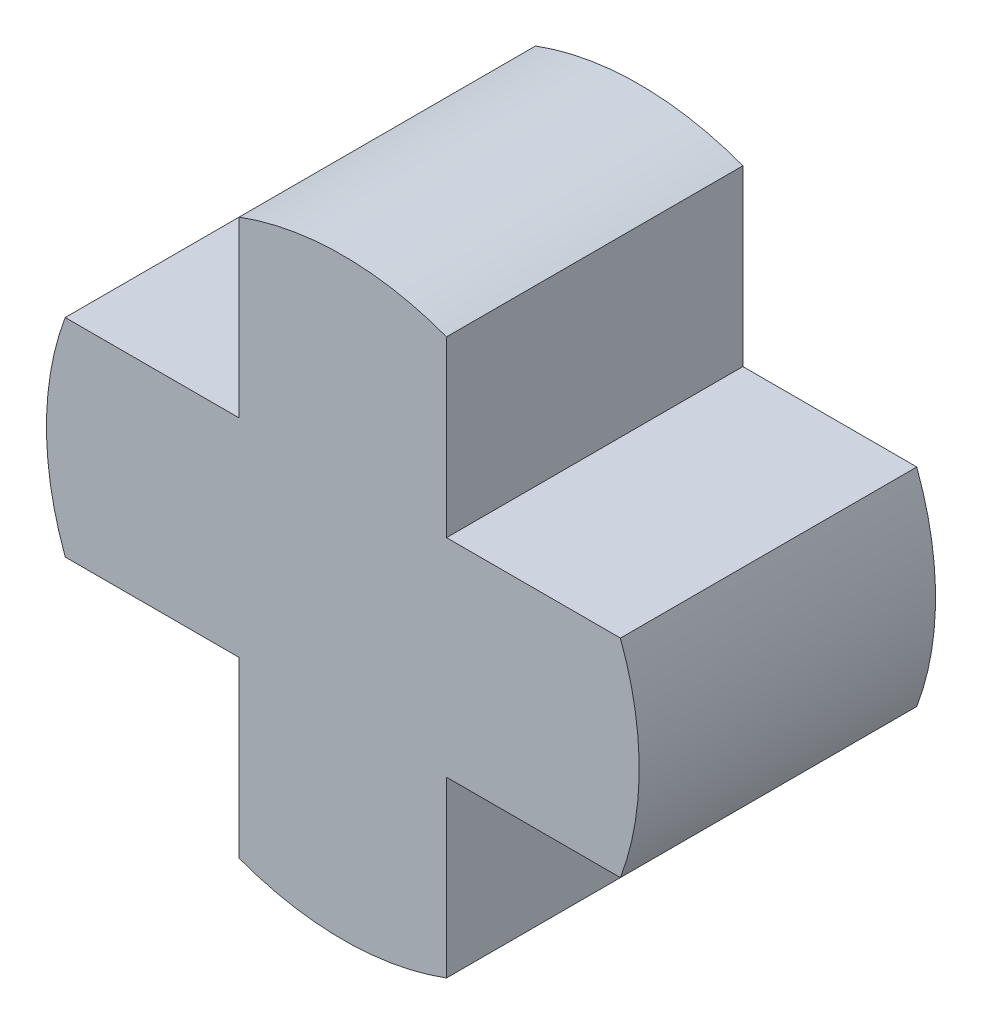
ISO-10303-21;
HEADER;
FILE_DESCRIPTION(('STEP AP214'),'2;1');
FILE_NAME('part.step','',(''),(''),'','','');
FILE_SCHEMA(('AUTOMOTIVE_DESIGN { 1 0 10303 214 1 1 1 1 }'));
ENDSEC;
DATA;
#1=APPLICATION_CONTEXT('core data for automotive mechanical design processes');
#2=APPLICATION_PROTOCOL_DEFINITION('international standard','automotive_design',2000,#1);
#3=PRODUCT_CONTEXT('',#1,'mechanical');
#4=PRODUCT('Part','Part','',(#3));
#5=PRODUCT_RELATED_PRODUCT_CATEGORY('part','',(#4));
#6=PRODUCT_DEFINITION_FORMATION('','',#4);
#7=PRODUCT_DEFINITION_CONTEXT('part definition',#1,'design');
#8=PRODUCT_DEFINITION('design','',#6,#7);
#9=PRODUCT_DEFINITION_SHAPE('','',#8);
#10=(LENGTH_UNIT() NAMED_UNIT(*) SI_UNIT(.MILLI.,.METRE.));
#11=(NAMED_UNIT(*) PLANE_ANGLE_UNIT() SI_UNIT($,.RADIAN.));
#12=(NAMED_UNIT(*) SI_UNIT($,.STERADIAN.) SOLID_ANGLE_UNIT());
#13=UNCERTAINTY_MEASURE_WITH_UNIT(LENGTH_MEASURE(1.E-05),#10,'distance_accuracy_value','');
#14=(GEOMETRIC_REPRESENTATION_CONTEXT(3) GLOBAL_UNCERTAINTY_ASSIGNED_CONTEXT((#13)) GLOBAL_UNIT_ASSIGNED_CONTEXT((#10,
#11,#12)) REPRESENTATION_CONTEXT('',''));
#15=CARTESIAN_POINT('',(0.,0.,0.));
#16=DIRECTION('',(0.,0.,1.));
#17=DIRECTION('',(1.,0.,0.));
#18=AXIS2_PLACEMENT_3D('',#15,#16,#17);
#19=CARTESIAN_POINT('',(3.5,0.,10.));
#20=DIRECTION('',(-1.,0.,0.));
#21=DIRECTION('',(0.,0.,1.));
#22=AXIS2_PLACEMENT_3D('',#19,#20,#21);
#23=PLANE('',#22);
#24=DIRECTION('',(0.,1.,0.));
#25=VECTOR('',#24,1.);
#26=CARTESIAN_POINT('',(3.5,0.,0.));
#27=LINE('',#26,#25);
#28=CARTESIAN_POINT('',(3.5,3.5,0.));
#29=VERTEX_POINT('',#28);
#30=CARTESIAN_POINT('',(3.5,9.3674969975976,0.));
#31=VERTEX_POINT('',#30);
#32=EDGE_CURVE('E155',#29,#31,#27,.T.);
#33=ORIENTED_EDGE('',*,*,#32,.T.);
#34=DIRECTION('',(0.,0.,-1.));
#35=VECTOR('',#34,1.);
#36=CARTESIAN_POINT('',(3.5,9.3674969975976,10.));
#37=LINE('',#36,#35);
#38=CARTESIAN_POINT('',(3.5,9.3674969975976,10.));
#39=VERTEX_POINT('',#38);
#40=EDGE_CURVE('E11',#39,#31,#37,.T.);
#41=ORIENTED_EDGE('',*,*,#40,.F.);
#42=DIRECTION('',(0.,1.,0.));
#43=VECTOR('',#42,1.);
#44=CARTESIAN_POINT('',(3.5,0.,10.));
#45=LINE('',#44,#43);
#46=CARTESIAN_POINT('',(3.5,3.5,10.));
#47=VERTEX_POINT('',#46);
#48=EDGE_CURVE('E184',#47,#39,#45,.T.);
#49=ORIENTED_EDGE('',*,*,#48,.F.);
#50=DIRECTION('',(0.,0.,-1.));
#51=VECTOR('',#50,1.);
#52=CARTESIAN_POINT('',(3.5,3.5,10.));
#53=LINE('',#52,#51);
#54=EDGE_CURVE('E50',#47,#29,#53,.T.);
#55=ORIENTED_EDGE('',*,*,#54,.T.);
#56=EDGE_LOOP('',(#33,#41,#49,#55));
#57=FACE_BOUND('',#56,.T.);
#58=ADVANCED_FACE('F34',(#57),#23,.F.);
#59=CARTESIAN_POINT('',(0.,0.,10.));
#60=DIRECTION('',(0.,0.,-1.));
#61=DIRECTION('',(-1.,0.,0.));
#62=AXIS2_PLACEMENT_3D('',#59,#60,#61);
#63=CYLINDRICAL_SURFACE('',#62,10.);
#64=CARTESIAN_POINT('',(0.,0.,0.));
#65=DIRECTION('',(0.,0.,1.));
#66=DIRECTION('',(1.,0.,0.));
#67=AXIS2_PLACEMENT_3D('',#64,#65,#66);
#68=CIRCLE('',#67,10.);
#69=CARTESIAN_POINT('',(-3.5,9.3674969975976,0.));
#70=VERTEX_POINT('',#69);
#71=EDGE_CURVE('E157',#31,#70,#68,.T.);
#72=ORIENTED_EDGE('',*,*,#71,.T.);
#73=DIRECTION('',(0.,0.,-1.));
#74=VECTOR('',#73,1.);
#75=CARTESIAN_POINT('',(-3.5,9.3674969975976,10.));
#76=LINE('',#75,#74);
#77=CARTESIAN_POINT('',(-3.5,9.3674969975976,10.));
#78=VERTEX_POINT('',#77);
#79=EDGE_CURVE('E42',#78,#70,#76,.T.);
#80=ORIENTED_EDGE('',*,*,#79,.F.);
#81=CARTESIAN_POINT('',(0.,0.,10.));
#82=DIRECTION('',(0.,0.,1.));
#83=DIRECTION('',(1.,0.,0.));
#84=AXIS2_PLACEMENT_3D('',#81,#82,#83);
#85=CIRCLE('',#84,10.);
#86=EDGE_CURVE('E101',#39,#78,#85,.T.);
#87=ORIENTED_EDGE('',*,*,#86,.F.);
#88=ORIENTED_EDGE('',*,*,#40,.T.);
#89=EDGE_LOOP('',(#72,#80,#87,#88));
#90=FACE_BOUND('',#89,.T.);
#91=ADVANCED_FACE('F207',(#90),#63,.T.);
#92=CARTESIAN_POINT('',(-3.5,0.,10.));
#93=DIRECTION('',(-1.,0.,0.));
#94=DIRECTION('',(0.,0.,1.));
#95=AXIS2_PLACEMENT_3D('',#92,#93,#94);
#96=PLANE('',#95);
#97=DIRECTION('',(0.,1.,0.));
#98=VECTOR('',#97,1.);
#99=CARTESIAN_POINT('',(-3.5,0.,0.));
#100=LINE('',#99,#98);
#101=CARTESIAN_POINT('',(-3.5,3.5,0.));
#102=VERTEX_POINT('',#101);
#103=EDGE_CURVE('E160',#102,#70,#100,.T.);
#104=ORIENTED_EDGE('',*,*,#103,.F.);
#105=DIRECTION('',(0.,0.,-1.));
#106=VECTOR('',#105,1.);
#107=CARTESIAN_POINT('',(-3.5,3.5,10.));
#108=LINE('',#107,#106);
#109=CARTESIAN_POINT('',(-3.5,3.5,10.));
#110=VERTEX_POINT('',#109);
#111=EDGE_CURVE('E200',#110,#102,#108,.T.);
#112=ORIENTED_EDGE('',*,*,#111,.F.);
#113=DIRECTION('',(0.,1.,0.));
#114=VECTOR('',#113,1.);
#115=CARTESIAN_POINT('',(-3.5,0.,10.));
#116=LINE('',#115,#114);
#117=EDGE_CURVE('E206',#110,#78,#116,.T.);
#118=ORIENTED_EDGE('',*,*,#117,.T.);
#119=ORIENTED_EDGE('',*,*,#79,.T.);
#120=EDGE_LOOP('',(#104,#112,#118,#119));
#121=FACE_BOUND('',#120,.T.);
#122=ADVANCED_FACE('F204',(#121),#96,.T.);
#123=CARTESIAN_POINT('',(0.,3.5,10.));
#124=DIRECTION('',(0.,1.,0.));
#125=DIRECTION('',(0.,0.,1.));
#126=AXIS2_PLACEMENT_3D('',#123,#124,#125);
#127=PLANE('',#126);
#128=DIRECTION('',(1.,0.,0.));
#129=VECTOR('',#128,1.);
#130=CARTESIAN_POINT('',(0.,3.5,0.));
#131=LINE('',#130,#129);
#132=CARTESIAN_POINT('',(-9.3674969975976,3.5,0.));
#133=VERTEX_POINT('',#132);
#134=EDGE_CURVE('E163',#133,#102,#131,.T.);
#135=ORIENTED_EDGE('',*,*,#134,.F.);
#136=DIRECTION('',(0.,0.,-1.));
#137=VECTOR('',#136,1.);
#138=CARTESIAN_POINT('',(-9.3674969975976,3.5,10.));
#139=LINE('',#138,#137);
#140=CARTESIAN_POINT('',(-9.3674969975976,3.5,10.));
#141=VERTEX_POINT('',#140);
#142=EDGE_CURVE('E198',#141,#133,#139,.T.);
#143=ORIENTED_EDGE('',*,*,#142,.F.);
#144=DIRECTION('',(1.,0.,0.));
#145=VECTOR('',#144,1.);
#146=CARTESIAN_POINT('',(0.,3.5,10.));
#147=LINE('',#146,#145);
#148=EDGE_CURVE('E219',#141,#110,#147,.T.);
#149=ORIENTED_EDGE('',*,*,#148,.T.);
#150=ORIENTED_EDGE('',*,*,#111,.T.);
#151=EDGE_LOOP('',(#135,#143,#149,#150));
#152=FACE_BOUND('',#151,.T.);
#153=ADVANCED_FACE('F215',(#152),#127,.T.);
#154=CARTESIAN_POINT('',(0.,0.,10.));
#155=DIRECTION('',(0.,0.,-1.));
#156=DIRECTION('',(-1.,0.,0.));
#157=AXIS2_PLACEMENT_3D('',#154,#155,#156);
#158=CYLINDRICAL_SURFACE('',#157,10.);
#159=CARTESIAN_POINT('',(0.,0.,0.));
#160=DIRECTION('',(0.,0.,1.));
#161=DIRECTION('',(1.,0.,0.));
#162=AXIS2_PLACEMENT_3D('',#159,#160,#161);
#163=CIRCLE('',#162,10.);
#164=CARTESIAN_POINT('',(-9.3674969975976,-3.5,0.));
#165=VERTEX_POINT('',#164);
#166=EDGE_CURVE('E166',#133,#165,#163,.T.);
#167=ORIENTED_EDGE('',*,*,#166,.T.);
#168=DIRECTION('',(0.,0.,-1.));
#169=VECTOR('',#168,1.);
#170=CARTESIAN_POINT('',(-9.3674969975976,-3.5,10.));
#171=LINE('',#170,#169);
#172=CARTESIAN_POINT('',(-9.3674969975976,-3.5,10.));
#173=VERTEX_POINT('',#172);
#174=EDGE_CURVE('E195',#173,#165,#171,.T.);
#175=ORIENTED_EDGE('',*,*,#174,.F.);
#176=CARTESIAN_POINT('',(0.,0.,10.));
#177=DIRECTION('',(0.,0.,1.));
#178=DIRECTION('',(1.,0.,0.));
#179=AXIS2_PLACEMENT_3D('',#176,#177,#178);
#180=CIRCLE('',#179,10.);
#181=EDGE_CURVE('E221',#141,#173,#180,.T.);
#182=ORIENTED_EDGE('',*,*,#181,.F.);
#183=ORIENTED_EDGE('',*,*,#142,.T.);
#184=EDGE_LOOP('',(#167,#175,#182,#183));
#185=FACE_BOUND('',#184,.T.);
#186=ADVANCED_FACE('F263',(#185),#158,.T.);
#187=CARTESIAN_POINT('',(0.,-3.5,10.));
#188=DIRECTION('',(0.,1.,0.));
#189=DIRECTION('',(0.,0.,1.));
#190=AXIS2_PLACEMENT_3D('',#187,#188,#189);
#191=PLANE('',#190);
#192=DIRECTION('',(1.,0.,0.));
#193=VECTOR('',#192,1.);
#194=CARTESIAN_POINT('',(0.,-3.5,0.));
#195=LINE('',#194,#193);
#196=CARTESIAN_POINT('',(-3.5,-3.5,0.));
#197=VERTEX_POINT('',#196);
#198=EDGE_CURVE('E168',#165,#197,#195,.T.);
#199=ORIENTED_EDGE('',*,*,#198,.T.);
#200=DIRECTION('',(0.,0.,-1.));
#201=VECTOR('',#200,1.);
#202=CARTESIAN_POINT('',(-3.5,-3.5,10.));
#203=LINE('',#202,#201);
#204=CARTESIAN_POINT('',(-3.5,-3.5,10.));
#205=VERTEX_POINT('',#204);
#206=EDGE_CURVE('E193',#205,#197,#203,.T.);
#207=ORIENTED_EDGE('',*,*,#206,.F.);
#208=DIRECTION('',(1.,0.,0.));
#209=VECTOR('',#208,1.);
#210=CARTESIAN_POINT('',(0.,-3.5,10.));
#211=LINE('',#210,#209);
#212=EDGE_CURVE('E227',#173,#205,#211,.T.);
#213=ORIENTED_EDGE('',*,*,#212,.F.);
#214=ORIENTED_EDGE('',*,*,#174,.T.);
#215=EDGE_LOOP('',(#199,#207,#213,#214));
#216=FACE_BOUND('',#215,.T.);
#217=ADVANCED_FACE('F266',(#216),#191,.F.);
#218=CARTESIAN_POINT('',(-3.5,0.,10.));
#219=DIRECTION('',(-1.,0.,0.));
#220=DIRECTION('',(0.,0.,1.));
#221=AXIS2_PLACEMENT_3D('',#218,#219,#220);
#222=PLANE('',#221);
#223=DIRECTION('',(0.,1.,0.));
#224=VECTOR('',#223,1.);
#225=CARTESIAN_POINT('',(-3.5,0.,0.));
#226=LINE('',#225,#224);
#227=CARTESIAN_POINT('',(-3.5,-9.3674969975976,0.));
#228=VERTEX_POINT('',#227);
#229=EDGE_CURVE('E171',#228,#197,#226,.T.);
#230=ORIENTED_EDGE('',*,*,#229,.F.);
#231=DIRECTION('',(0.,0.,-1.));
#232=VECTOR('',#231,1.);
#233=CARTESIAN_POINT('',(-3.5,-9.3674969975976,10.));
#234=LINE('',#233,#232);
#235=CARTESIAN_POINT('',(-3.5,-9.3674969975976,10.));
#236=VERTEX_POINT('',#235);
#237=EDGE_CURVE('E191',#236,#228,#234,.T.);
#238=ORIENTED_EDGE('',*,*,#237,.F.);
#239=DIRECTION('',(0.,1.,0.));
#240=VECTOR('',#239,1.);
#241=CARTESIAN_POINT('',(-3.5,0.,10.));
#242=LINE('',#241,#240);
#243=EDGE_CURVE('E229',#236,#205,#242,.T.);
#244=ORIENTED_EDGE('',*,*,#243,.T.);
#245=ORIENTED_EDGE('',*,*,#206,.T.);
#246=EDGE_LOOP('',(#230,#238,#244,#245));
#247=FACE_BOUND('',#246,.T.);
#248=ADVANCED_FACE('F270',(#247),#222,.T.);
#249=CARTESIAN_POINT('',(0.,0.,10.));
#250=DIRECTION('',(0.,0.,-1.));
#251=DIRECTION('',(-1.,0.,0.));
#252=AXIS2_PLACEMENT_3D('',#249,#250,#251);
#253=CYLINDRICAL_SURFACE('',#252,10.);
#254=CARTESIAN_POINT('',(0.,0.,0.));
#255=DIRECTION('',(0.,0.,1.));
#256=DIRECTION('',(1.,0.,0.));
#257=AXIS2_PLACEMENT_3D('',#254,#255,#256);
#258=CIRCLE('',#257,10.);
#259=CARTESIAN_POINT('',(3.5,-9.3674969975976,0.));
#260=VERTEX_POINT('',#259);
#261=EDGE_CURVE('E174',#228,#260,#258,.T.);
#262=ORIENTED_EDGE('',*,*,#261,.T.);
#263=DIRECTION('',(0.,0.,-1.));
#264=VECTOR('',#263,1.);
#265=CARTESIAN_POINT('',(3.5,-9.3674969975976,10.));
#266=LINE('',#265,#264);
#267=CARTESIAN_POINT('',(3.5,-9.3674969975976,10.));
#268=VERTEX_POINT('',#267);
#269=EDGE_CURVE('E188',#268,#260,#266,.T.);
#270=ORIENTED_EDGE('',*,*,#269,.F.);
#271=CARTESIAN_POINT('',(0.,0.,10.));
#272=DIRECTION('',(0.,0.,1.));
#273=DIRECTION('',(1.,0.,0.));
#274=AXIS2_PLACEMENT_3D('',#271,#272,#273);
#275=CIRCLE('',#274,10.);
#276=EDGE_CURVE('E232',#236,#268,#275,.T.);
#277=ORIENTED_EDGE('',*,*,#276,.F.);
#278=ORIENTED_EDGE('',*,*,#237,.T.);
#279=EDGE_LOOP('',(#262,#270,#277,#278));
#280=FACE_BOUND('',#279,.T.);
#281=ADVANCED_FACE('F237',(#280),#253,.T.);
#282=CARTESIAN_POINT('',(3.5,0.,10.));
#283=DIRECTION('',(-1.,0.,0.));
#284=DIRECTION('',(0.,0.,1.));
#285=AXIS2_PLACEMENT_3D('',#282,#283,#284);
#286=PLANE('',#285);
#287=DIRECTION('',(0.,1.,0.));
#288=VECTOR('',#287,1.);
#289=CARTESIAN_POINT('',(3.5,0.,0.));
#290=LINE('',#289,#288);
#291=CARTESIAN_POINT('',(3.5,-3.5,0.));
#292=VERTEX_POINT('',#291);
#293=EDGE_CURVE('E176',#260,#292,#290,.T.);
#294=ORIENTED_EDGE('',*,*,#293,.T.);
#295=DIRECTION('',(0.,0.,-1.));
#296=VECTOR('',#295,1.);
#297=CARTESIAN_POINT('',(3.5,-3.5,10.));
#298=LINE('',#297,#296);
#299=CARTESIAN_POINT('',(3.5,-3.5,10.));
#300=VERTEX_POINT('',#299);
#301=EDGE_CURVE('E147',#300,#292,#298,.T.);
#302=ORIENTED_EDGE('',*,*,#301,.F.);
#303=DIRECTION('',(0.,1.,0.));
#304=VECTOR('',#303,1.);
#305=CARTESIAN_POINT('',(3.5,0.,10.));
#306=LINE('',#305,#304);
#307=EDGE_CURVE('E135',#268,#300,#306,.T.);
#308=ORIENTED_EDGE('',*,*,#307,.F.);
#309=ORIENTED_EDGE('',*,*,#269,.T.);
#310=EDGE_LOOP('',(#294,#302,#308,#309));
#311=FACE_BOUND('',#310,.T.);
#312=ADVANCED_FACE('F241',(#311),#286,.F.);
#313=CARTESIAN_POINT('',(0.,-3.5,10.));
#314=DIRECTION('',(0.,1.,0.));
#315=DIRECTION('',(0.,0.,1.));
#316=AXIS2_PLACEMENT_3D('',#313,#314,#315);
#317=PLANE('',#316);
#318=DIRECTION('',(1.,0.,0.));
#319=VECTOR('',#318,1.);
#320=CARTESIAN_POINT('',(0.,-3.5,0.));
#321=LINE('',#320,#319);
#322=CARTESIAN_POINT('',(9.3674969975976,-3.5,0.));
#323=VERTEX_POINT('',#322);
#324=EDGE_CURVE('E144',#292,#323,#321,.T.);
#325=ORIENTED_EDGE('',*,*,#324,.T.);
#326=DIRECTION('',(0.,0.,-1.));
#327=VECTOR('',#326,1.);
#328=CARTESIAN_POINT('',(9.3674969975976,-3.5,10.));
#329=LINE('',#328,#327);
#330=CARTESIAN_POINT('',(9.3674969975976,-3.5,10.));
#331=VERTEX_POINT('',#330);
#332=EDGE_CURVE('E141',#331,#323,#329,.T.);
#333=ORIENTED_EDGE('',*,*,#332,.F.);
#334=DIRECTION('',(1.,0.,0.));
#335=VECTOR('',#334,1.);
#336=CARTESIAN_POINT('',(0.,-3.5,10.));
#337=LINE('',#336,#335);
#338=EDGE_CURVE('E128',#300,#331,#337,.T.);
#339=ORIENTED_EDGE('',*,*,#338,.F.);
#340=ORIENTED_EDGE('',*,*,#301,.T.);
#341=EDGE_LOOP('',(#325,#333,#339,#340));
#342=FACE_BOUND('',#341,.T.);
#343=ADVANCED_FACE('F142',(#342),#317,.F.);
#344=CARTESIAN_POINT('',(0.,0.,10.));
#345=DIRECTION('',(0.,0.,-1.));
#346=DIRECTION('',(-1.,0.,0.));
#347=AXIS2_PLACEMENT_3D('',#344,#345,#346);
#348=CYLINDRICAL_SURFACE('',#347,10.);
#349=CARTESIAN_POINT('',(0.,0.,0.));
#350=DIRECTION('',(0.,0.,1.));
#351=DIRECTION('',(1.,0.,0.));
#352=AXIS2_PLACEMENT_3D('',#349,#350,#351);
#353=CIRCLE('',#352,10.);
#354=CARTESIAN_POINT('',(9.3674969975976,3.5,0.));
#355=VERTEX_POINT('',#354);
#356=EDGE_CURVE('E179',#323,#355,#353,.T.);
#357=ORIENTED_EDGE('',*,*,#356,.T.);
#358=DIRECTION('',(0.,0.,-1.));
#359=VECTOR('',#358,1.);
#360=CARTESIAN_POINT('',(9.3674969975976,3.5,10.));
#361=LINE('',#360,#359);
#362=CARTESIAN_POINT('',(9.3674969975976,3.5,10.));
#363=VERTEX_POINT('',#362);
#364=EDGE_CURVE('E89',#363,#355,#361,.T.);
#365=ORIENTED_EDGE('',*,*,#364,.F.);
#366=CARTESIAN_POINT('',(0.,0.,10.));
#367=DIRECTION('',(0.,0.,1.));
#368=DIRECTION('',(1.,0.,0.));
#369=AXIS2_PLACEMENT_3D('',#366,#367,#368);
#370=CIRCLE('',#369,10.);
#371=EDGE_CURVE('E133',#331,#363,#370,.T.);
#372=ORIENTED_EDGE('',*,*,#371,.F.);
#373=ORIENTED_EDGE('',*,*,#332,.T.);
#374=EDGE_LOOP('',(#357,#365,#372,#373));
#375=FACE_BOUND('',#374,.T.);
#376=ADVANCED_FACE('F149',(#375),#348,.T.);
#377=CARTESIAN_POINT('',(0.,3.5,10.));
#378=DIRECTION('',(0.,1.,0.));
#379=DIRECTION('',(0.,0.,1.));
#380=AXIS2_PLACEMENT_3D('',#377,#378,#379);
#381=PLANE('',#380);
#382=DIRECTION('',(1.,0.,0.));
#383=VECTOR('',#382,1.);
#384=CARTESIAN_POINT('',(0.,3.5,0.));
#385=LINE('',#384,#383);
#386=EDGE_CURVE('E181',#29,#355,#385,.T.);
#387=ORIENTED_EDGE('',*,*,#386,.F.);
#388=ORIENTED_EDGE('',*,*,#54,.F.);
#389=DIRECTION('',(1.,0.,0.));
#390=VECTOR('',#389,1.);
#391=CARTESIAN_POINT('',(0.,3.5,10.));
#392=LINE('',#391,#390);
#393=EDGE_CURVE('E150',#47,#363,#392,.T.);
#394=ORIENTED_EDGE('',*,*,#393,.T.);
#395=ORIENTED_EDGE('',*,*,#364,.T.);
#396=EDGE_LOOP('',(#387,#388,#394,#395));
#397=FACE_BOUND('',#396,.T.);
#398=ADVANCED_FACE('F242',(#397),#381,.T.);
#399=CARTESIAN_POINT('',(0.,0.,10.));
#400=DIRECTION('',(0.,0.,1.));
#401=DIRECTION('',(1.,0.,0.));
#402=AXIS2_PLACEMENT_3D('',#399,#400,#401);
#403=PLANE('',#402);
#404=ORIENTED_EDGE('',*,*,#48,.T.);
#405=ORIENTED_EDGE('',*,*,#86,.T.);
#406=ORIENTED_EDGE('',*,*,#117,.F.);
#407=ORIENTED_EDGE('',*,*,#148,.F.);
#408=ORIENTED_EDGE('',*,*,#181,.T.);
#409=ORIENTED_EDGE('',*,*,#212,.T.);
#410=ORIENTED_EDGE('',*,*,#243,.F.);
#411=ORIENTED_EDGE('',*,*,#276,.T.);
#412=ORIENTED_EDGE('',*,*,#307,.T.);
#413=ORIENTED_EDGE('',*,*,#338,.T.);
#414=ORIENTED_EDGE('',*,*,#371,.T.);
#415=ORIENTED_EDGE('',*,*,#393,.F.);
#416=EDGE_LOOP('',(#404,#405,#406,#407,#408,#409,#410,#411,#412,#413,#414,#415));
#417=FACE_BOUND('',#416,.T.);
#418=ADVANCED_FACE('F130',(#417),#403,.T.);
#419=CARTESIAN_POINT('',(0.,0.,0.));
#420=DIRECTION('',(0.,0.,1.));
#421=DIRECTION('',(1.,0.,0.));
#422=AXIS2_PLACEMENT_3D('',#419,#420,#421);
#423=PLANE('',#422);
#424=ORIENTED_EDGE('',*,*,#32,.F.);
#425=ORIENTED_EDGE('',*,*,#386,.T.);
#426=ORIENTED_EDGE('',*,*,#356,.F.);
#427=ORIENTED_EDGE('',*,*,#324,.F.);
#428=ORIENTED_EDGE('',*,*,#293,.F.);
#429=ORIENTED_EDGE('',*,*,#261,.F.);
#430=ORIENTED_EDGE('',*,*,#229,.T.);
#431=ORIENTED_EDGE('',*,*,#198,.F.);
#432=ORIENTED_EDGE('',*,*,#166,.F.);
#433=ORIENTED_EDGE('',*,*,#134,.T.);
#434=ORIENTED_EDGE('',*,*,#103,.T.);
#435=ORIENTED_EDGE('',*,*,#71,.F.);
#436=EDGE_LOOP('',(#424,#425,#426,#427,#428,#429,#430,#431,#432,#433,#434,#435));
#437=FACE_BOUND('',#436,.T.);
#438=ADVANCED_FACE('F210',(#437),#423,.F.);
#439=CLOSED_SHELL('',(#58,#91,#122,#153,#186,#217,#248,#281,#312,#343,#376,#398,#418,#438));
#440=MANIFOLD_SOLID_BREP('B2',#439);
#441=ADVANCED_BREP_SHAPE_REPRESENTATION('',(#18,#440),#14);
#442=SHAPE_DEFINITION_REPRESENTATION(#9,#441);
ENDSEC;
END-ISO-10303-21;
